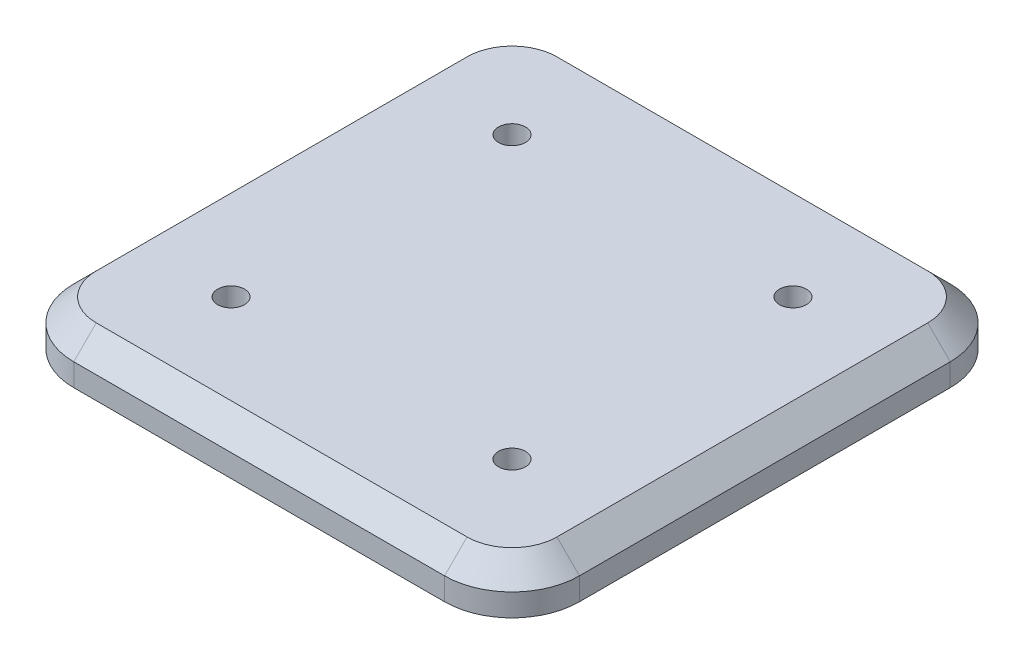
ISO-10303-21;
HEADER;
FILE_DESCRIPTION(('STEP AP214'),'2;1');
FILE_NAME('part.step','',(''),(''),'','','');
FILE_SCHEMA(('AUTOMOTIVE_DESIGN { 1 0 10303 214 1 1 1 1 }'));
ENDSEC;
DATA;
#1=APPLICATION_CONTEXT('core data for automotive mechanical design processes');
#2=APPLICATION_PROTOCOL_DEFINITION('international standard','automotive_design',2000,#1);
#3=PRODUCT_CONTEXT('',#1,'mechanical');
#4=PRODUCT('Part','Part','',(#3));
#5=PRODUCT_RELATED_PRODUCT_CATEGORY('part','',(#4));
#6=PRODUCT_DEFINITION_FORMATION('','',#4);
#7=PRODUCT_DEFINITION_CONTEXT('part definition',#1,'design');
#8=PRODUCT_DEFINITION('design','',#6,#7);
#9=PRODUCT_DEFINITION_SHAPE('','',#8);
#10=(LENGTH_UNIT() NAMED_UNIT(*) SI_UNIT(.MILLI.,.METRE.));
#11=(NAMED_UNIT(*) PLANE_ANGLE_UNIT() SI_UNIT($,.RADIAN.));
#12=(NAMED_UNIT(*) SI_UNIT($,.STERADIAN.) SOLID_ANGLE_UNIT());
#13=UNCERTAINTY_MEASURE_WITH_UNIT(LENGTH_MEASURE(1.E-05),#10,'distance_accuracy_value','');
#14=(GEOMETRIC_REPRESENTATION_CONTEXT(3) GLOBAL_UNCERTAINTY_ASSIGNED_CONTEXT((#13)) GLOBAL_UNIT_ASSIGNED_CONTEXT((#10,
#11,#12)) REPRESENTATION_CONTEXT('',''));
#15=CARTESIAN_POINT('',(0.,0.,0.));
#16=DIRECTION('',(0.,0.,1.));
#17=DIRECTION('',(1.,0.,0.));
#18=AXIS2_PLACEMENT_3D('',#15,#16,#17);
#19=CARTESIAN_POINT('',(-112.5,20.,112.5));
#20=DIRECTION('',(1.,0.,0.));
#21=DIRECTION('',(0.,0.,-1.));
#22=AXIS2_PLACEMENT_3D('',#19,#20,#21);
#23=PLANE('',#22);
#24=DIRECTION('',(0.,-1.,0.));
#25=VECTOR('',#24,1.);
#26=CARTESIAN_POINT('',(-112.5,20.,82.5));
#27=LINE('',#26,#25);
#28=CARTESIAN_POINT('',(-112.5,0.,82.5));
#29=VERTEX_POINT('',#28);
#30=CARTESIAN_POINT('',(-112.5,9.99999999999999,82.5));
#31=VERTEX_POINT('',#30);
#32=EDGE_CURVE('E231',#29,#31,#27,.F.);
#33=ORIENTED_EDGE('',*,*,#32,.T.);
#34=DIRECTION('',(0.,0.,-1.));
#35=VECTOR('',#34,1.);
#36=CARTESIAN_POINT('',(-112.5,9.99999999999999,112.5));
#37=LINE('',#36,#35);
#38=CARTESIAN_POINT('',(-112.5,9.99999999999999,-82.5));
#39=VERTEX_POINT('',#38);
#40=EDGE_CURVE('E266',#31,#39,#37,.T.);
#41=ORIENTED_EDGE('',*,*,#40,.T.);
#42=DIRECTION('',(0.,-1.,0.));
#43=VECTOR('',#42,1.);
#44=CARTESIAN_POINT('',(-112.5,20.,-82.5));
#45=LINE('',#44,#43);
#46=CARTESIAN_POINT('',(-112.5,0.,-82.5));
#47=VERTEX_POINT('',#46);
#48=EDGE_CURVE('E229',#39,#47,#45,.T.);
#49=ORIENTED_EDGE('',*,*,#48,.T.);
#50=DIRECTION('',(0.,0.,1.));
#51=VECTOR('',#50,1.);
#52=CARTESIAN_POINT('',(-112.5,0.,112.5));
#53=LINE('',#52,#51);
#54=EDGE_CURVE('E204',#47,#29,#53,.T.);
#55=ORIENTED_EDGE('',*,*,#54,.T.);
#56=EDGE_LOOP('',(#33,#41,#49,#55));
#57=FACE_BOUND('',#56,.T.);
#58=ADVANCED_FACE('F33',(#57),#23,.F.);
#59=CARTESIAN_POINT('',(112.5,20.,112.5));
#60=DIRECTION('',(0.,0.,-1.));
#61=DIRECTION('',(-1.,0.,0.));
#62=AXIS2_PLACEMENT_3D('',#59,#60,#61);
#63=PLANE('',#62);
#64=DIRECTION('',(0.,-1.,0.));
#65=VECTOR('',#64,1.);
#66=CARTESIAN_POINT('',(82.5,20.,112.5));
#67=LINE('',#66,#65);
#68=CARTESIAN_POINT('',(82.5,0.,112.5));
#69=VERTEX_POINT('',#68);
#70=CARTESIAN_POINT('',(82.5,9.99999999999999,112.5));
#71=VERTEX_POINT('',#70);
#72=EDGE_CURVE('E216',#69,#71,#67,.F.);
#73=ORIENTED_EDGE('',*,*,#72,.T.);
#74=DIRECTION('',(-1.,0.,0.));
#75=VECTOR('',#74,1.);
#76=CARTESIAN_POINT('',(112.5,9.99999999999999,112.5));
#77=LINE('',#76,#75);
#78=CARTESIAN_POINT('',(-82.5,9.99999999999999,112.5));
#79=VERTEX_POINT('',#78);
#80=EDGE_CURVE('E262',#71,#79,#77,.T.);
#81=ORIENTED_EDGE('',*,*,#80,.T.);
#82=DIRECTION('',(0.,-1.,0.));
#83=VECTOR('',#82,1.);
#84=CARTESIAN_POINT('',(-82.5,20.,112.5));
#85=LINE('',#84,#83);
#86=CARTESIAN_POINT('',(-82.5,0.,112.5));
#87=VERTEX_POINT('',#86);
#88=EDGE_CURVE('E219',#79,#87,#85,.T.);
#89=ORIENTED_EDGE('',*,*,#88,.T.);
#90=DIRECTION('',(1.,0.,0.));
#91=VECTOR('',#90,1.);
#92=CARTESIAN_POINT('',(112.5,0.,112.5));
#93=LINE('',#92,#91);
#94=EDGE_CURVE('E207',#87,#69,#93,.T.);
#95=ORIENTED_EDGE('',*,*,#94,.T.);
#96=EDGE_LOOP('',(#73,#81,#89,#95));
#97=FACE_BOUND('',#96,.T.);
#98=ADVANCED_FACE('F367',(#97),#63,.F.);
#99=CARTESIAN_POINT('',(112.5,20.,-112.5));
#100=DIRECTION('',(-1.,0.,0.));
#101=DIRECTION('',(0.,0.,1.));
#102=AXIS2_PLACEMENT_3D('',#99,#100,#101);
#103=PLANE('',#102);
#104=DIRECTION('',(0.,-1.,0.));
#105=VECTOR('',#104,1.);
#106=CARTESIAN_POINT('',(112.5,20.,-82.5));
#107=LINE('',#106,#105);
#108=CARTESIAN_POINT('',(112.5,0.,-82.5));
#109=VERTEX_POINT('',#108);
#110=CARTESIAN_POINT('',(112.5,9.99999999999999,-82.5));
#111=VERTEX_POINT('',#110);
#112=EDGE_CURVE('E240',#109,#111,#107,.F.);
#113=ORIENTED_EDGE('',*,*,#112,.T.);
#114=DIRECTION('',(0.,0.,1.));
#115=VECTOR('',#114,1.);
#116=CARTESIAN_POINT('',(112.5,9.99999999999999,-112.5));
#117=LINE('',#116,#115);
#118=CARTESIAN_POINT('',(112.5,9.99999999999999,82.5));
#119=VERTEX_POINT('',#118);
#120=EDGE_CURVE('E11',#111,#119,#117,.T.);
#121=ORIENTED_EDGE('',*,*,#120,.T.);
#122=DIRECTION('',(0.,-1.,0.));
#123=VECTOR('',#122,1.);
#124=CARTESIAN_POINT('',(112.5,20.,82.5));
#125=LINE('',#124,#123);
#126=CARTESIAN_POINT('',(112.5,0.,82.5));
#127=VERTEX_POINT('',#126);
#128=EDGE_CURVE('E238',#119,#127,#125,.T.);
#129=ORIENTED_EDGE('',*,*,#128,.T.);
#130=DIRECTION('',(0.,0.,-1.));
#131=VECTOR('',#130,1.);
#132=CARTESIAN_POINT('',(112.5,0.,-112.5));
#133=LINE('',#132,#131);
#134=EDGE_CURVE('E210',#127,#109,#133,.T.);
#135=ORIENTED_EDGE('',*,*,#134,.T.);
#136=EDGE_LOOP('',(#113,#121,#129,#135));
#137=FACE_BOUND('',#136,.T.);
#138=ADVANCED_FACE('F346',(#137),#103,.F.);
#139=CARTESIAN_POINT('',(-112.5,20.,-112.5));
#140=DIRECTION('',(0.,0.,1.));
#141=DIRECTION('',(1.,0.,0.));
#142=AXIS2_PLACEMENT_3D('',#139,#140,#141);
#143=PLANE('',#142);
#144=DIRECTION('',(0.,-1.,0.));
#145=VECTOR('',#144,1.);
#146=CARTESIAN_POINT('',(-82.5,20.,-112.5));
#147=LINE('',#146,#145);
#148=CARTESIAN_POINT('',(-82.5,0.,-112.5));
#149=VERTEX_POINT('',#148);
#150=CARTESIAN_POINT('',(-82.5,9.99999999999999,-112.5));
#151=VERTEX_POINT('',#150);
#152=EDGE_CURVE('E236',#149,#151,#147,.F.);
#153=ORIENTED_EDGE('',*,*,#152,.T.);
#154=DIRECTION('',(1.,0.,0.));
#155=VECTOR('',#154,1.);
#156=CARTESIAN_POINT('',(-112.5,9.99999999999999,-112.5));
#157=LINE('',#156,#155);
#158=CARTESIAN_POINT('',(82.5,9.99999999999999,-112.5));
#159=VERTEX_POINT('',#158);
#160=EDGE_CURVE('E57',#151,#159,#157,.T.);
#161=ORIENTED_EDGE('',*,*,#160,.T.);
#162=DIRECTION('',(0.,-1.,0.));
#163=VECTOR('',#162,1.);
#164=CARTESIAN_POINT('',(82.5,20.,-112.5));
#165=LINE('',#164,#163);
#166=CARTESIAN_POINT('',(82.5,0.,-112.5));
#167=VERTEX_POINT('',#166);
#168=EDGE_CURVE('E234',#159,#167,#165,.T.);
#169=ORIENTED_EDGE('',*,*,#168,.T.);
#170=DIRECTION('',(-1.,0.,0.));
#171=VECTOR('',#170,1.);
#172=CARTESIAN_POINT('',(-112.5,0.,-112.5));
#173=LINE('',#172,#171);
#174=EDGE_CURVE('E213',#167,#149,#173,.T.);
#175=ORIENTED_EDGE('',*,*,#174,.T.);
#176=EDGE_LOOP('',(#153,#161,#169,#175));
#177=FACE_BOUND('',#176,.T.);
#178=ADVANCED_FACE('F306',(#177),#143,.F.);
#179=CARTESIAN_POINT('',(0.,20.,0.));
#180=DIRECTION('',(0.,-1.,0.));
#181=DIRECTION('',(0.,0.,-1.));
#182=AXIS2_PLACEMENT_3D('',#179,#180,#181);
#183=PLANE('',#182);
#184=CARTESIAN_POINT('',(-62.5,20.,-62.5));
#185=DIRECTION('',(0.,1.,0.));
#186=DIRECTION('',(0.,0.,1.));
#187=AXIS2_PLACEMENT_3D('',#184,#185,#186);
#188=CIRCLE('',#187,6.);
#189=CARTESIAN_POINT('',(-62.5,20.,-56.5));
#190=VERTEX_POINT('',#189);
#191=EDGE_CURVE('E157',#190,#190,#188,.T.);
#192=ORIENTED_EDGE('',*,*,#191,.F.);
#193=EDGE_LOOP('',(#192));
#194=FACE_BOUND('',#193,.T.);
#195=CARTESIAN_POINT('',(62.5,20.,-62.5));
#196=DIRECTION('',(0.,1.,0.));
#197=DIRECTION('',(0.,0.,1.));
#198=AXIS2_PLACEMENT_3D('',#195,#196,#197);
#199=CIRCLE('',#198,6.00000000000001);
#200=CARTESIAN_POINT('',(62.5,20.,-56.5));
#201=VERTEX_POINT('',#200);
#202=EDGE_CURVE('E156',#201,#201,#199,.T.);
#203=ORIENTED_EDGE('',*,*,#202,.F.);
#204=EDGE_LOOP('',(#203));
#205=FACE_BOUND('',#204,.T.);
#206=CARTESIAN_POINT('',(62.5,20.,62.5));
#207=DIRECTION('',(0.,1.,0.));
#208=DIRECTION('',(0.,0.,1.));
#209=AXIS2_PLACEMENT_3D('',#206,#207,#208);
#210=CIRCLE('',#209,6.00000000000001);
#211=CARTESIAN_POINT('',(62.5,20.,68.5));
#212=VERTEX_POINT('',#211);
#213=EDGE_CURVE('E167',#212,#212,#210,.T.);
#214=ORIENTED_EDGE('',*,*,#213,.F.);
#215=EDGE_LOOP('',(#214));
#216=FACE_BOUND('',#215,.T.);
#217=CARTESIAN_POINT('',(-62.5,20.,62.5));
#218=DIRECTION('',(0.,1.,0.));
#219=DIRECTION('',(0.,0.,1.));
#220=AXIS2_PLACEMENT_3D('',#217,#218,#219);
#221=CIRCLE('',#220,6.);
#222=CARTESIAN_POINT('',(-62.5,20.,68.5));
#223=VERTEX_POINT('',#222);
#224=EDGE_CURVE('E173',#223,#223,#221,.T.);
#225=ORIENTED_EDGE('',*,*,#224,.F.);
#226=EDGE_LOOP('',(#225));
#227=FACE_BOUND('',#226,.T.);
#228=DIRECTION('',(1.,0.,0.));
#229=VECTOR('',#228,1.);
#230=CARTESIAN_POINT('',(0.,20.,102.5));
#231=LINE('',#230,#229);
#232=CARTESIAN_POINT('',(-82.5,20.,102.5));
#233=VERTEX_POINT('',#232);
#234=CARTESIAN_POINT('',(82.5,20.,102.5));
#235=VERTEX_POINT('',#234);
#236=EDGE_CURVE('E254',#233,#235,#231,.T.);
#237=ORIENTED_EDGE('',*,*,#236,.T.);
#238=CARTESIAN_POINT('',(82.5,20.,82.5));
#239=DIRECTION('',(0.,-1.,0.));
#240=DIRECTION('',(0.,0.,-1.));
#241=AXIS2_PLACEMENT_3D('',#238,#239,#240);
#242=CIRCLE('',#241,20.);
#243=CARTESIAN_POINT('',(102.5,20.,82.5));
#244=VERTEX_POINT('',#243);
#245=EDGE_CURVE('E256',#235,#244,#242,.F.);
#246=ORIENTED_EDGE('',*,*,#245,.T.);
#247=DIRECTION('',(0.,0.,-1.));
#248=VECTOR('',#247,1.);
#249=CARTESIAN_POINT('',(102.5,20.,0.));
#250=LINE('',#249,#248);
#251=CARTESIAN_POINT('',(102.5,20.,-82.5));
#252=VERTEX_POINT('',#251);
#253=EDGE_CURVE('E242',#244,#252,#250,.T.);
#254=ORIENTED_EDGE('',*,*,#253,.T.);
#255=CARTESIAN_POINT('',(82.5,20.,-82.5));
#256=DIRECTION('',(0.,-1.,0.));
#257=DIRECTION('',(0.,0.,-1.));
#258=AXIS2_PLACEMENT_3D('',#255,#256,#257);
#259=CIRCLE('',#258,20.);
#260=CARTESIAN_POINT('',(82.5,20.,-102.5));
#261=VERTEX_POINT('',#260);
#262=EDGE_CURVE('E244',#252,#261,#259,.F.);
#263=ORIENTED_EDGE('',*,*,#262,.T.);
#264=DIRECTION('',(-1.,0.,0.));
#265=VECTOR('',#264,1.);
#266=CARTESIAN_POINT('',(0.,20.,-102.5));
#267=LINE('',#266,#265);
#268=CARTESIAN_POINT('',(-82.5,20.,-102.5));
#269=VERTEX_POINT('',#268);
#270=EDGE_CURVE('E246',#261,#269,#267,.T.);
#271=ORIENTED_EDGE('',*,*,#270,.T.);
#272=CARTESIAN_POINT('',(-82.5,20.,-82.5));
#273=DIRECTION('',(0.,-1.,0.));
#274=DIRECTION('',(0.,0.,-1.));
#275=AXIS2_PLACEMENT_3D('',#272,#273,#274);
#276=CIRCLE('',#275,20.);
#277=CARTESIAN_POINT('',(-102.5,20.,-82.5));
#278=VERTEX_POINT('',#277);
#279=EDGE_CURVE('E248',#269,#278,#276,.F.);
#280=ORIENTED_EDGE('',*,*,#279,.T.);
#281=DIRECTION('',(0.,0.,1.));
#282=VECTOR('',#281,1.);
#283=CARTESIAN_POINT('',(-102.5,20.,0.));
#284=LINE('',#283,#282);
#285=CARTESIAN_POINT('',(-102.5,20.,82.5));
#286=VERTEX_POINT('',#285);
#287=EDGE_CURVE('E250',#278,#286,#284,.T.);
#288=ORIENTED_EDGE('',*,*,#287,.T.);
#289=CARTESIAN_POINT('',(-82.5,20.,82.5));
#290=DIRECTION('',(0.,-1.,0.));
#291=DIRECTION('',(0.,0.,-1.));
#292=AXIS2_PLACEMENT_3D('',#289,#290,#291);
#293=CIRCLE('',#292,20.);
#294=EDGE_CURVE('E252',#286,#233,#293,.F.);
#295=ORIENTED_EDGE('',*,*,#294,.T.);
#296=EDGE_LOOP('',(#237,#246,#254,#263,#271,#280,#288,#295));
#297=FACE_BOUND('',#296,.T.);
#298=ADVANCED_FACE('F332',(#194,#205,#216,#227,#297),#183,.F.);
#299=CARTESIAN_POINT('',(0.,0.,0.));
#300=DIRECTION('',(0.,-1.,0.));
#301=DIRECTION('',(0.,0.,-1.));
#302=AXIS2_PLACEMENT_3D('',#299,#300,#301);
#303=PLANE('',#302);
#304=CARTESIAN_POINT('',(87.5,0.,-87.5));
#305=DIRECTION('',(0.,-1.,0.));
#306=DIRECTION('',(0.,0.,-1.));
#307=AXIS2_PLACEMENT_3D('',#304,#305,#306);
#308=CIRCLE('',#307,6.00000000000001);
#309=CARTESIAN_POINT('',(87.5,0.,-93.5));
#310=VERTEX_POINT('',#309);
#311=EDGE_CURVE('E179',#310,#310,#308,.T.);
#312=ORIENTED_EDGE('',*,*,#311,.F.);
#313=EDGE_LOOP('',(#312));
#314=FACE_BOUND('',#313,.T.);
#315=CARTESIAN_POINT('',(87.5,0.,87.5));
#316=DIRECTION('',(0.,-1.,0.));
#317=DIRECTION('',(0.,0.,-1.));
#318=AXIS2_PLACEMENT_3D('',#315,#316,#317);
#319=CIRCLE('',#318,6.00000000000001);
#320=CARTESIAN_POINT('',(87.5,0.,81.5));
#321=VERTEX_POINT('',#320);
#322=EDGE_CURVE('E185',#321,#321,#319,.T.);
#323=ORIENTED_EDGE('',*,*,#322,.F.);
#324=EDGE_LOOP('',(#323));
#325=FACE_BOUND('',#324,.T.);
#326=CARTESIAN_POINT('',(-87.5,0.,87.5));
#327=DIRECTION('',(0.,-1.,0.));
#328=DIRECTION('',(0.,0.,-1.));
#329=AXIS2_PLACEMENT_3D('',#326,#327,#328);
#330=CIRCLE('',#329,6.00000000000001);
#331=CARTESIAN_POINT('',(-87.5,0.,81.5));
#332=VERTEX_POINT('',#331);
#333=EDGE_CURVE('E191',#332,#332,#330,.T.);
#334=ORIENTED_EDGE('',*,*,#333,.F.);
#335=EDGE_LOOP('',(#334));
#336=FACE_BOUND('',#335,.T.);
#337=CARTESIAN_POINT('',(-87.5,0.,-87.5));
#338=DIRECTION('',(0.,-1.,0.));
#339=DIRECTION('',(0.,0.,-1.));
#340=AXIS2_PLACEMENT_3D('',#337,#338,#339);
#341=CIRCLE('',#340,6.00000000000001);
#342=CARTESIAN_POINT('',(-87.5,0.,-93.5));
#343=VERTEX_POINT('',#342);
#344=EDGE_CURVE('E197',#343,#343,#341,.T.);
#345=ORIENTED_EDGE('',*,*,#344,.F.);
#346=EDGE_LOOP('',(#345));
#347=FACE_BOUND('',#346,.T.);
#348=ORIENTED_EDGE('',*,*,#94,.F.);
#349=CARTESIAN_POINT('',(-82.5,0.,82.5));
#350=DIRECTION('',(0.,-1.,0.));
#351=DIRECTION('',(0.,0.,-1.));
#352=AXIS2_PLACEMENT_3D('',#349,#350,#351);
#353=CIRCLE('',#352,30.);
#354=EDGE_CURVE('E227',#87,#29,#353,.T.);
#355=ORIENTED_EDGE('',*,*,#354,.T.);
#356=ORIENTED_EDGE('',*,*,#54,.F.);
#357=CARTESIAN_POINT('',(-82.5,0.,-82.5));
#358=DIRECTION('',(0.,-1.,0.));
#359=DIRECTION('',(0.,0.,-1.));
#360=AXIS2_PLACEMENT_3D('',#357,#358,#359);
#361=CIRCLE('',#360,30.);
#362=EDGE_CURVE('E225',#47,#149,#361,.T.);
#363=ORIENTED_EDGE('',*,*,#362,.T.);
#364=ORIENTED_EDGE('',*,*,#174,.F.);
#365=CARTESIAN_POINT('',(82.5,0.,-82.5));
#366=DIRECTION('',(0.,-1.,0.));
#367=DIRECTION('',(0.,0.,-1.));
#368=AXIS2_PLACEMENT_3D('',#365,#366,#367);
#369=CIRCLE('',#368,30.);
#370=EDGE_CURVE('E223',#167,#109,#369,.T.);
#371=ORIENTED_EDGE('',*,*,#370,.T.);
#372=ORIENTED_EDGE('',*,*,#134,.F.);
#373=CARTESIAN_POINT('',(82.5,0.,82.5));
#374=DIRECTION('',(0.,-1.,0.));
#375=DIRECTION('',(0.,0.,-1.));
#376=AXIS2_PLACEMENT_3D('',#373,#374,#375);
#377=CIRCLE('',#376,30.);
#378=EDGE_CURVE('E221',#127,#69,#377,.T.);
#379=ORIENTED_EDGE('',*,*,#378,.T.);
#380=EDGE_LOOP('',(#348,#355,#356,#363,#364,#371,#372,#379));
#381=FACE_BOUND('',#380,.T.);
#382=ADVANCED_FACE('F311',(#314,#325,#336,#347,#381),#303,.T.);
#383=CARTESIAN_POINT('',(-82.5,20.,82.5));
#384=DIRECTION('',(0.,-1.,0.));
#385=DIRECTION('',(0.,0.,-1.));
#386=AXIS2_PLACEMENT_3D('',#383,#384,#385);
#387=CYLINDRICAL_SURFACE('',#386,30.);
#388=ORIENTED_EDGE('',*,*,#88,.F.);
#389=CARTESIAN_POINT('',(-82.5,9.99999999999999,82.5));
#390=DIRECTION('',(0.,-1.,0.));
#391=DIRECTION('',(0.,0.,-1.));
#392=AXIS2_PLACEMENT_3D('',#389,#390,#391);
#393=CIRCLE('',#392,30.);
#394=EDGE_CURVE('E264',#79,#31,#393,.T.);
#395=ORIENTED_EDGE('',*,*,#394,.T.);
#396=ORIENTED_EDGE('',*,*,#32,.F.);
#397=ORIENTED_EDGE('',*,*,#354,.F.);
#398=EDGE_LOOP('',(#388,#395,#396,#397));
#399=FACE_BOUND('',#398,.T.);
#400=ADVANCED_FACE('F319',(#399),#387,.T.);
#401=CARTESIAN_POINT('',(-82.5,20.,-82.5));
#402=DIRECTION('',(0.,-1.,0.));
#403=DIRECTION('',(0.,0.,-1.));
#404=AXIS2_PLACEMENT_3D('',#401,#402,#403);
#405=CYLINDRICAL_SURFACE('',#404,30.);
#406=ORIENTED_EDGE('',*,*,#48,.F.);
#407=CARTESIAN_POINT('',(-82.5,9.99999999999999,-82.5));
#408=DIRECTION('',(0.,-1.,0.));
#409=DIRECTION('',(0.,0.,-1.));
#410=AXIS2_PLACEMENT_3D('',#407,#408,#409);
#411=CIRCLE('',#410,30.);
#412=EDGE_CURVE('E268',#39,#151,#411,.T.);
#413=ORIENTED_EDGE('',*,*,#412,.T.);
#414=ORIENTED_EDGE('',*,*,#152,.F.);
#415=ORIENTED_EDGE('',*,*,#362,.F.);
#416=EDGE_LOOP('',(#406,#413,#414,#415));
#417=FACE_BOUND('',#416,.T.);
#418=ADVANCED_FACE('F304',(#417),#405,.T.);
#419=CARTESIAN_POINT('',(82.5,20.,-82.5));
#420=DIRECTION('',(0.,-1.,0.));
#421=DIRECTION('',(0.,0.,-1.));
#422=AXIS2_PLACEMENT_3D('',#419,#420,#421);
#423=CYLINDRICAL_SURFACE('',#422,30.);
#424=ORIENTED_EDGE('',*,*,#168,.F.);
#425=CARTESIAN_POINT('',(82.5,9.99999999999999,-82.5));
#426=DIRECTION('',(0.,-1.,0.));
#427=DIRECTION('',(0.,0.,-1.));
#428=AXIS2_PLACEMENT_3D('',#425,#426,#427);
#429=CIRCLE('',#428,30.);
#430=EDGE_CURVE('E42',#159,#111,#429,.T.);
#431=ORIENTED_EDGE('',*,*,#430,.T.);
#432=ORIENTED_EDGE('',*,*,#112,.F.);
#433=ORIENTED_EDGE('',*,*,#370,.F.);
#434=EDGE_LOOP('',(#424,#431,#432,#433));
#435=FACE_BOUND('',#434,.T.);
#436=ADVANCED_FACE('F380',(#435),#423,.T.);
#437=CARTESIAN_POINT('',(82.5,20.,82.5));
#438=DIRECTION('',(0.,-1.,0.));
#439=DIRECTION('',(0.,0.,-1.));
#440=AXIS2_PLACEMENT_3D('',#437,#438,#439);
#441=CYLINDRICAL_SURFACE('',#440,30.);
#442=ORIENTED_EDGE('',*,*,#128,.F.);
#443=CARTESIAN_POINT('',(82.5,9.99999999999999,82.5));
#444=DIRECTION('',(0.,-1.,0.));
#445=DIRECTION('',(0.,0.,-1.));
#446=AXIS2_PLACEMENT_3D('',#443,#444,#445);
#447=CIRCLE('',#446,30.);
#448=EDGE_CURVE('E259',#119,#71,#447,.T.);
#449=ORIENTED_EDGE('',*,*,#448,.T.);
#450=ORIENTED_EDGE('',*,*,#72,.F.);
#451=ORIENTED_EDGE('',*,*,#378,.F.);
#452=EDGE_LOOP('',(#442,#449,#450,#451));
#453=FACE_BOUND('',#452,.T.);
#454=ADVANCED_FACE('F350',(#453),#441,.T.);
#455=CARTESIAN_POINT('',(-82.5,20.,-82.5));
#456=DIRECTION('',(0.,-1.,0.));
#457=DIRECTION('',(0.,0.,-1.));
#458=AXIS2_PLACEMENT_3D('',#455,#456,#457);
#459=CONICAL_SURFACE('',#458,20.,0.785398163397448);
#460=DIRECTION('',(0.,0.707106781186547,0.707106781186547));
#461=VECTOR('',#460,1.);
#462=CARTESIAN_POINT('',(-82.5,9.99999999999999,-112.5));
#463=LINE('',#462,#461);
#464=EDGE_CURVE('E286',#151,#269,#463,.T.);
#465=ORIENTED_EDGE('',*,*,#464,.F.);
#466=ORIENTED_EDGE('',*,*,#412,.F.);
#467=DIRECTION('',(-0.707106781186547,-0.707106781186547,0.));
#468=VECTOR('',#467,1.);
#469=CARTESIAN_POINT('',(-102.5,20.,-82.5));
#470=LINE('',#469,#468);
#471=EDGE_CURVE('E37',#278,#39,#470,.T.);
#472=ORIENTED_EDGE('',*,*,#471,.F.);
#473=ORIENTED_EDGE('',*,*,#279,.F.);
#474=EDGE_LOOP('',(#465,#466,#472,#473));
#475=FACE_BOUND('',#474,.T.);
#476=ADVANCED_FACE('F35',(#475),#459,.T.);
#477=CARTESIAN_POINT('',(-102.5,20.,0.));
#478=DIRECTION('',(0.707106781186547,-0.707106781186547,0.));
#479=DIRECTION('',(0.,0.,1.));
#480=AXIS2_PLACEMENT_3D('',#477,#478,#479);
#481=PLANE('',#480);
#482=ORIENTED_EDGE('',*,*,#471,.T.);
#483=ORIENTED_EDGE('',*,*,#40,.F.);
#484=DIRECTION('',(-0.707106781186547,-0.707106781186547,0.));
#485=VECTOR('',#484,1.);
#486=CARTESIAN_POINT('',(-102.5,20.,82.5));
#487=LINE('',#486,#485);
#488=EDGE_CURVE('E284',#286,#31,#487,.T.);
#489=ORIENTED_EDGE('',*,*,#488,.F.);
#490=ORIENTED_EDGE('',*,*,#287,.F.);
#491=EDGE_LOOP('',(#482,#483,#489,#490));
#492=FACE_BOUND('',#491,.T.);
#493=ADVANCED_FACE('F296',(#492),#481,.F.);
#494=CARTESIAN_POINT('',(0.,20.,-102.5));
#495=DIRECTION('',(0.,-0.707106781186547,0.707106781186547));
#496=DIRECTION('',(-1.,0.,0.));
#497=AXIS2_PLACEMENT_3D('',#494,#495,#496);
#498=PLANE('',#497);
#499=ORIENTED_EDGE('',*,*,#464,.T.);
#500=ORIENTED_EDGE('',*,*,#270,.F.);
#501=DIRECTION('',(0.,0.707106781186547,0.707106781186547));
#502=VECTOR('',#501,1.);
#503=CARTESIAN_POINT('',(82.5,9.99999999999999,-112.5));
#504=LINE('',#503,#502);
#505=EDGE_CURVE('E281',#159,#261,#504,.T.);
#506=ORIENTED_EDGE('',*,*,#505,.F.);
#507=ORIENTED_EDGE('',*,*,#160,.F.);
#508=EDGE_LOOP('',(#499,#500,#506,#507));
#509=FACE_BOUND('',#508,.T.);
#510=ADVANCED_FACE('F335',(#509),#498,.F.);
#511=CARTESIAN_POINT('',(-82.5,20.,82.5));
#512=DIRECTION('',(0.,-1.,0.));
#513=DIRECTION('',(0.,0.,-1.));
#514=AXIS2_PLACEMENT_3D('',#511,#512,#513);
#515=CONICAL_SURFACE('',#514,20.,0.785398163397448);
#516=ORIENTED_EDGE('',*,*,#488,.T.);
#517=ORIENTED_EDGE('',*,*,#394,.F.);
#518=DIRECTION('',(0.,-0.707106781186547,0.707106781186547));
#519=VECTOR('',#518,1.);
#520=CARTESIAN_POINT('',(-82.5,20.,102.5));
#521=LINE('',#520,#519);
#522=EDGE_CURVE('E278',#233,#79,#521,.T.);
#523=ORIENTED_EDGE('',*,*,#522,.F.);
#524=ORIENTED_EDGE('',*,*,#294,.F.);
#525=EDGE_LOOP('',(#516,#517,#523,#524));
#526=FACE_BOUND('',#525,.T.);
#527=ADVANCED_FACE('F323',(#526),#515,.T.);
#528=CARTESIAN_POINT('',(82.5,20.,-82.5));
#529=DIRECTION('',(0.,-1.,0.));
#530=DIRECTION('',(0.,0.,-1.));
#531=AXIS2_PLACEMENT_3D('',#528,#529,#530);
#532=CONICAL_SURFACE('',#531,20.,0.785398163397448);
#533=ORIENTED_EDGE('',*,*,#505,.T.);
#534=ORIENTED_EDGE('',*,*,#262,.F.);
#535=DIRECTION('',(-0.707106781186547,0.707106781186547,0.));
#536=VECTOR('',#535,1.);
#537=CARTESIAN_POINT('',(112.5,9.99999999999999,-82.5));
#538=LINE('',#537,#536);
#539=EDGE_CURVE('E275',#111,#252,#538,.T.);
#540=ORIENTED_EDGE('',*,*,#539,.F.);
#541=ORIENTED_EDGE('',*,*,#430,.F.);
#542=EDGE_LOOP('',(#533,#534,#540,#541));
#543=FACE_BOUND('',#542,.T.);
#544=ADVANCED_FACE('F337',(#543),#532,.T.);
#545=CARTESIAN_POINT('',(0.,20.,102.5));
#546=DIRECTION('',(0.,-0.707106781186547,-0.707106781186547));
#547=DIRECTION('',(1.,0.,0.));
#548=AXIS2_PLACEMENT_3D('',#545,#546,#547);
#549=PLANE('',#548);
#550=ORIENTED_EDGE('',*,*,#522,.T.);
#551=ORIENTED_EDGE('',*,*,#80,.F.);
#552=DIRECTION('',(0.,-0.707106781186547,0.707106781186547));
#553=VECTOR('',#552,1.);
#554=CARTESIAN_POINT('',(82.5,20.,102.5));
#555=LINE('',#554,#553);
#556=EDGE_CURVE('E273',#235,#71,#555,.T.);
#557=ORIENTED_EDGE('',*,*,#556,.F.);
#558=ORIENTED_EDGE('',*,*,#236,.F.);
#559=EDGE_LOOP('',(#550,#551,#557,#558));
#560=FACE_BOUND('',#559,.T.);
#561=ADVANCED_FACE('F328',(#560),#549,.F.);
#562=CARTESIAN_POINT('',(102.5,20.,0.));
#563=DIRECTION('',(-0.707106781186547,-0.707106781186547,0.));
#564=DIRECTION('',(0.,0.,-1.));
#565=AXIS2_PLACEMENT_3D('',#562,#563,#564);
#566=PLANE('',#565);
#567=ORIENTED_EDGE('',*,*,#539,.T.);
#568=ORIENTED_EDGE('',*,*,#253,.F.);
#569=DIRECTION('',(-0.707106781186547,0.707106781186547,0.));
#570=VECTOR('',#569,1.);
#571=CARTESIAN_POINT('',(112.5,9.99999999999999,82.5));
#572=LINE('',#571,#570);
#573=EDGE_CURVE('E203',#119,#244,#572,.T.);
#574=ORIENTED_EDGE('',*,*,#573,.F.);
#575=ORIENTED_EDGE('',*,*,#120,.F.);
#576=EDGE_LOOP('',(#567,#568,#574,#575));
#577=FACE_BOUND('',#576,.T.);
#578=ADVANCED_FACE('F343',(#577),#566,.F.);
#579=CARTESIAN_POINT('',(82.5,20.,82.5));
#580=DIRECTION('',(0.,-1.,0.));
#581=DIRECTION('',(0.,0.,-1.));
#582=AXIS2_PLACEMENT_3D('',#579,#580,#581);
#583=CONICAL_SURFACE('',#582,20.,0.785398163397448);
#584=ORIENTED_EDGE('',*,*,#556,.T.);
#585=ORIENTED_EDGE('',*,*,#448,.F.);
#586=ORIENTED_EDGE('',*,*,#573,.T.);
#587=ORIENTED_EDGE('',*,*,#245,.F.);
#588=EDGE_LOOP('',(#584,#585,#586,#587));
#589=FACE_BOUND('',#588,.T.);
#590=ADVANCED_FACE('F353',(#589),#583,.T.);
#591=CARTESIAN_POINT('',(-87.5,9.99999999999999,-87.5));
#592=DIRECTION('',(0.,-1.,0.));
#593=DIRECTION('',(0.,0.,-1.));
#594=AXIS2_PLACEMENT_3D('',#591,#592,#593);
#595=CONICAL_SURFACE('',#594,6.00000000000001,1.02974425867666);
#596=CARTESIAN_POINT('',(-87.5,13.6051637141654,-87.5));
#597=VERTEX_POINT('',#596);
#598=VERTEX_LOOP('',#597);
#599=FACE_BOUND('',#598,.T.);
#600=CARTESIAN_POINT('',(-87.5,9.99999999999999,-87.5));
#601=DIRECTION('',(0.,-1.,0.));
#602=DIRECTION('',(0.,0.,-1.));
#603=AXIS2_PLACEMENT_3D('',#600,#601,#602);
#604=CIRCLE('',#603,6.00000000000001);
#605=CARTESIAN_POINT('',(-87.5,9.99999999999999,-93.5));
#606=VERTEX_POINT('',#605);
#607=EDGE_CURVE('E200',#606,#606,#604,.T.);
#608=ORIENTED_EDGE('',*,*,#607,.T.);
#609=EDGE_LOOP('',(#608));
#610=FACE_BOUND('',#609,.T.);
#611=ADVANCED_FACE('F355',(#599,#610),#595,.F.);
#612=CARTESIAN_POINT('',(-87.5,0.,-87.5));
#613=DIRECTION('',(0.,-1.,0.));
#614=DIRECTION('',(0.,0.,-1.));
#615=AXIS2_PLACEMENT_3D('',#612,#613,#614);
#616=CYLINDRICAL_SURFACE('',#615,6.00000000000001);
#617=ORIENTED_EDGE('',*,*,#607,.F.);
#618=EDGE_LOOP('',(#617));
#619=FACE_BOUND('',#618,.T.);
#620=ORIENTED_EDGE('',*,*,#344,.T.);
#621=EDGE_LOOP('',(#620));
#622=FACE_BOUND('',#621,.T.);
#623=ADVANCED_FACE('F361',(#619,#622),#616,.F.);
#624=CARTESIAN_POINT('',(-87.5,9.99999999999999,87.5));
#625=DIRECTION('',(0.,-1.,0.));
#626=DIRECTION('',(0.,0.,-1.));
#627=AXIS2_PLACEMENT_3D('',#624,#625,#626);
#628=CONICAL_SURFACE('',#627,6.00000000000001,1.02974425867666);
#629=CARTESIAN_POINT('',(-87.5,13.6051637141654,87.5));
#630=VERTEX_POINT('',#629);
#631=VERTEX_LOOP('',#630);
#632=FACE_BOUND('',#631,.T.);
#633=CARTESIAN_POINT('',(-87.5,9.99999999999999,87.5));
#634=DIRECTION('',(0.,-1.,0.));
#635=DIRECTION('',(0.,0.,-1.));
#636=AXIS2_PLACEMENT_3D('',#633,#634,#635);
#637=CIRCLE('',#636,6.00000000000001);
#638=CARTESIAN_POINT('',(-87.5,9.99999999999999,81.5));
#639=VERTEX_POINT('',#638);
#640=EDGE_CURVE('E194',#639,#639,#637,.T.);
#641=ORIENTED_EDGE('',*,*,#640,.T.);
#642=EDGE_LOOP('',(#641));
#643=FACE_BOUND('',#642,.T.);
#644=ADVANCED_FACE('F438',(#632,#643),#628,.F.);
#645=CARTESIAN_POINT('',(-87.5,0.,87.5));
#646=DIRECTION('',(0.,-1.,0.));
#647=DIRECTION('',(0.,0.,-1.));
#648=AXIS2_PLACEMENT_3D('',#645,#646,#647);
#649=CYLINDRICAL_SURFACE('',#648,6.00000000000001);
#650=ORIENTED_EDGE('',*,*,#640,.F.);
#651=EDGE_LOOP('',(#650));
#652=FACE_BOUND('',#651,.T.);
#653=ORIENTED_EDGE('',*,*,#333,.T.);
#654=EDGE_LOOP('',(#653));
#655=FACE_BOUND('',#654,.T.);
#656=ADVANCED_FACE('F448',(#652,#655),#649,.F.);
#657=CARTESIAN_POINT('',(87.5,9.99999999999999,87.5));
#658=DIRECTION('',(0.,-1.,0.));
#659=DIRECTION('',(0.,0.,-1.));
#660=AXIS2_PLACEMENT_3D('',#657,#658,#659);
#661=CONICAL_SURFACE('',#660,6.00000000000001,1.02974425867666);
#662=CARTESIAN_POINT('',(87.5,13.6051637141654,87.5));
#663=VERTEX_POINT('',#662);
#664=VERTEX_LOOP('',#663);
#665=FACE_BOUND('',#664,.T.);
#666=CARTESIAN_POINT('',(87.5,9.99999999999999,87.5));
#667=DIRECTION('',(0.,-1.,0.));
#668=DIRECTION('',(0.,0.,-1.));
#669=AXIS2_PLACEMENT_3D('',#666,#667,#668);
#670=CIRCLE('',#669,6.00000000000001);
#671=CARTESIAN_POINT('',(87.5,9.99999999999999,81.5));
#672=VERTEX_POINT('',#671);
#673=EDGE_CURVE('E188',#672,#672,#670,.T.);
#674=ORIENTED_EDGE('',*,*,#673,.T.);
#675=EDGE_LOOP('',(#674));
#676=FACE_BOUND('',#675,.T.);
#677=ADVANCED_FACE('F458',(#665,#676),#661,.F.);
#678=CARTESIAN_POINT('',(87.5,0.,87.5));
#679=DIRECTION('',(0.,-1.,0.));
#680=DIRECTION('',(0.,0.,-1.));
#681=AXIS2_PLACEMENT_3D('',#678,#679,#680);
#682=CYLINDRICAL_SURFACE('',#681,6.00000000000001);
#683=ORIENTED_EDGE('',*,*,#673,.F.);
#684=EDGE_LOOP('',(#683));
#685=FACE_BOUND('',#684,.T.);
#686=ORIENTED_EDGE('',*,*,#322,.T.);
#687=EDGE_LOOP('',(#686));
#688=FACE_BOUND('',#687,.T.);
#689=ADVANCED_FACE('F468',(#685,#688),#682,.F.);
#690=CARTESIAN_POINT('',(87.5,9.99999999999999,-87.5));
#691=DIRECTION('',(0.,-1.,0.));
#692=DIRECTION('',(0.,0.,-1.));
#693=AXIS2_PLACEMENT_3D('',#690,#691,#692);
#694=CONICAL_SURFACE('',#693,6.00000000000001,1.02974425867666);
#695=CARTESIAN_POINT('',(87.5,13.6051637141654,-87.5));
#696=VERTEX_POINT('',#695);
#697=VERTEX_LOOP('',#696);
#698=FACE_BOUND('',#697,.T.);
#699=CARTESIAN_POINT('',(87.5,9.99999999999999,-87.5));
#700=DIRECTION('',(0.,-1.,0.));
#701=DIRECTION('',(0.,0.,-1.));
#702=AXIS2_PLACEMENT_3D('',#699,#700,#701);
#703=CIRCLE('',#702,6.00000000000001);
#704=CARTESIAN_POINT('',(87.5,9.99999999999999,-93.5));
#705=VERTEX_POINT('',#704);
#706=EDGE_CURVE('E182',#705,#705,#703,.T.);
#707=ORIENTED_EDGE('',*,*,#706,.T.);
#708=EDGE_LOOP('',(#707));
#709=FACE_BOUND('',#708,.T.);
#710=ADVANCED_FACE('F478',(#698,#709),#694,.F.);
#711=CARTESIAN_POINT('',(87.5,0.,-87.5));
#712=DIRECTION('',(0.,-1.,0.));
#713=DIRECTION('',(0.,0.,-1.));
#714=AXIS2_PLACEMENT_3D('',#711,#712,#713);
#715=CYLINDRICAL_SURFACE('',#714,6.00000000000001);
#716=ORIENTED_EDGE('',*,*,#706,.F.);
#717=EDGE_LOOP('',(#716));
#718=FACE_BOUND('',#717,.T.);
#719=ORIENTED_EDGE('',*,*,#311,.T.);
#720=EDGE_LOOP('',(#719));
#721=FACE_BOUND('',#720,.T.);
#722=ADVANCED_FACE('F488',(#718,#721),#715,.F.);
#723=CARTESIAN_POINT('',(-62.5,10.,62.5));
#724=DIRECTION('',(0.,1.,0.));
#725=DIRECTION('',(0.,0.,1.));
#726=AXIS2_PLACEMENT_3D('',#723,#724,#725);
#727=CONICAL_SURFACE('',#726,6.,1.02974425867665);
#728=CARTESIAN_POINT('',(-62.5,6.39483628583465,62.5));
#729=VERTEX_POINT('',#728);
#730=VERTEX_LOOP('',#729);
#731=FACE_BOUND('',#730,.T.);
#732=CARTESIAN_POINT('',(-62.5,10.,62.5));
#733=DIRECTION('',(0.,1.,0.));
#734=DIRECTION('',(0.,0.,1.));
#735=AXIS2_PLACEMENT_3D('',#732,#733,#734);
#736=CIRCLE('',#735,6.);
#737=CARTESIAN_POINT('',(-62.5,10.,68.5));
#738=VERTEX_POINT('',#737);
#739=EDGE_CURVE('E176',#738,#738,#736,.T.);
#740=ORIENTED_EDGE('',*,*,#739,.T.);
#741=EDGE_LOOP('',(#740));
#742=FACE_BOUND('',#741,.T.);
#743=ADVANCED_FACE('F498',(#731,#742),#727,.F.);
#744=CARTESIAN_POINT('',(-62.5,20.,62.5));
#745=DIRECTION('',(0.,1.,0.));
#746=DIRECTION('',(0.,0.,1.));
#747=AXIS2_PLACEMENT_3D('',#744,#745,#746);
#748=CYLINDRICAL_SURFACE('',#747,6.);
#749=ORIENTED_EDGE('',*,*,#739,.F.);
#750=EDGE_LOOP('',(#749));
#751=FACE_BOUND('',#750,.T.);
#752=ORIENTED_EDGE('',*,*,#224,.T.);
#753=EDGE_LOOP('',(#752));
#754=FACE_BOUND('',#753,.T.);
#755=ADVANCED_FACE('F517',(#751,#754),#748,.F.);
#756=CARTESIAN_POINT('',(62.5,10.,62.5));
#757=DIRECTION('',(0.,1.,0.));
#758=DIRECTION('',(0.,0.,1.));
#759=AXIS2_PLACEMENT_3D('',#756,#757,#758);
#760=CONICAL_SURFACE('',#759,6.00000000000001,1.02974425867666);
#761=CARTESIAN_POINT('',(62.5,6.39483628583465,62.5));
#762=VERTEX_POINT('',#761);
#763=VERTEX_LOOP('',#762);
#764=FACE_BOUND('',#763,.T.);
#765=CARTESIAN_POINT('',(62.5,10.,62.5));
#766=DIRECTION('',(0.,1.,0.));
#767=DIRECTION('',(0.,0.,1.));
#768=AXIS2_PLACEMENT_3D('',#765,#766,#767);
#769=CIRCLE('',#768,6.00000000000001);
#770=CARTESIAN_POINT('',(62.5,10.,68.5));
#771=VERTEX_POINT('',#770);
#772=EDGE_CURVE('E170',#771,#771,#769,.T.);
#773=ORIENTED_EDGE('',*,*,#772,.T.);
#774=EDGE_LOOP('',(#773));
#775=FACE_BOUND('',#774,.T.);
#776=ADVANCED_FACE('F527',(#764,#775),#760,.F.);
#777=CARTESIAN_POINT('',(62.5,20.,62.5));
#778=DIRECTION('',(0.,1.,0.));
#779=DIRECTION('',(0.,0.,1.));
#780=AXIS2_PLACEMENT_3D('',#777,#778,#779);
#781=CYLINDRICAL_SURFACE('',#780,6.00000000000001);
#782=ORIENTED_EDGE('',*,*,#772,.F.);
#783=EDGE_LOOP('',(#782));
#784=FACE_BOUND('',#783,.T.);
#785=ORIENTED_EDGE('',*,*,#213,.T.);
#786=EDGE_LOOP('',(#785));
#787=FACE_BOUND('',#786,.T.);
#788=ADVANCED_FACE('F537',(#784,#787),#781,.F.);
#789=CARTESIAN_POINT('',(62.5,10.,-62.5));
#790=DIRECTION('',(0.,1.,0.));
#791=DIRECTION('',(0.,0.,1.));
#792=AXIS2_PLACEMENT_3D('',#789,#790,#791);
#793=CONICAL_SURFACE('',#792,6.00000000000001,1.02974425867666);
#794=CARTESIAN_POINT('',(62.5,6.39483628583465,-62.5));
#795=VERTEX_POINT('',#794);
#796=VERTEX_LOOP('',#795);
#797=FACE_BOUND('',#796,.T.);
#798=CARTESIAN_POINT('',(62.5,10.,-62.5));
#799=DIRECTION('',(0.,1.,0.));
#800=DIRECTION('',(0.,0.,1.));
#801=AXIS2_PLACEMENT_3D('',#798,#799,#800);
#802=CIRCLE('',#801,6.00000000000001);
#803=CARTESIAN_POINT('',(62.5,10.,-56.5));
#804=VERTEX_POINT('',#803);
#805=EDGE_CURVE('E160',#804,#804,#802,.T.);
#806=ORIENTED_EDGE('',*,*,#805,.T.);
#807=EDGE_LOOP('',(#806));
#808=FACE_BOUND('',#807,.T.);
#809=ADVANCED_FACE('F547',(#797,#808),#793,.F.);
#810=CARTESIAN_POINT('',(62.5,20.,-62.5));
#811=DIRECTION('',(0.,1.,0.));
#812=DIRECTION('',(0.,0.,1.));
#813=AXIS2_PLACEMENT_3D('',#810,#811,#812);
#814=CYLINDRICAL_SURFACE('',#813,6.00000000000001);
#815=ORIENTED_EDGE('',*,*,#805,.F.);
#816=EDGE_LOOP('',(#815));
#817=FACE_BOUND('',#816,.T.);
#818=ORIENTED_EDGE('',*,*,#202,.T.);
#819=EDGE_LOOP('',(#818));
#820=FACE_BOUND('',#819,.T.);
#821=ADVANCED_FACE('F150',(#817,#820),#814,.F.);
#822=CARTESIAN_POINT('',(-62.5,10.,-62.5));
#823=DIRECTION('',(0.,1.,0.));
#824=DIRECTION('',(0.,0.,1.));
#825=AXIS2_PLACEMENT_3D('',#822,#823,#824);
#826=CONICAL_SURFACE('',#825,6.,1.02974425867665);
#827=CARTESIAN_POINT('',(-62.5,6.39483628583465,-62.5));
#828=VERTEX_POINT('',#827);
#829=VERTEX_LOOP('',#828);
#830=FACE_BOUND('',#829,.T.);
#831=CARTESIAN_POINT('',(-62.5,10.,-62.5));
#832=DIRECTION('',(0.,1.,0.));
#833=DIRECTION('',(0.,0.,1.));
#834=AXIS2_PLACEMENT_3D('',#831,#832,#833);
#835=CIRCLE('',#834,6.);
#836=CARTESIAN_POINT('',(-62.5,10.,-56.5));
#837=VERTEX_POINT('',#836);
#838=EDGE_CURVE('E154',#837,#837,#835,.T.);
#839=ORIENTED_EDGE('',*,*,#838,.T.);
#840=EDGE_LOOP('',(#839));
#841=FACE_BOUND('',#840,.T.);
#842=ADVANCED_FACE('F146',(#830,#841),#826,.F.);
#843=CARTESIAN_POINT('',(-62.5,20.,-62.5));
#844=DIRECTION('',(0.,1.,0.));
#845=DIRECTION('',(0.,0.,1.));
#846=AXIS2_PLACEMENT_3D('',#843,#844,#845);
#847=CYLINDRICAL_SURFACE('',#846,6.);
#848=ORIENTED_EDGE('',*,*,#838,.F.);
#849=EDGE_LOOP('',(#848));
#850=FACE_BOUND('',#849,.T.);
#851=ORIENTED_EDGE('',*,*,#191,.T.);
#852=EDGE_LOOP('',(#851));
#853=FACE_BOUND('',#852,.T.);
#854=ADVANCED_FACE('F149',(#850,#853),#847,.F.);
#855=CLOSED_SHELL('',(#58,#98,#138,#178,#298,#382,#400,#418,#436,#454,#476,#493,#510,#527,#544,
#561,#578,#590,#611,#623,#644,#656,#677,#689,#710,#722,#743,#755,#776,#788,#809,#821,#842,#854));
#856=MANIFOLD_SOLID_BREP('B2',#855);
#857=ADVANCED_BREP_SHAPE_REPRESENTATION('',(#18,#856),#14);
#858=SHAPE_DEFINITION_REPRESENTATION(#9,#857);
ENDSEC;
END-ISO-10303-21;
